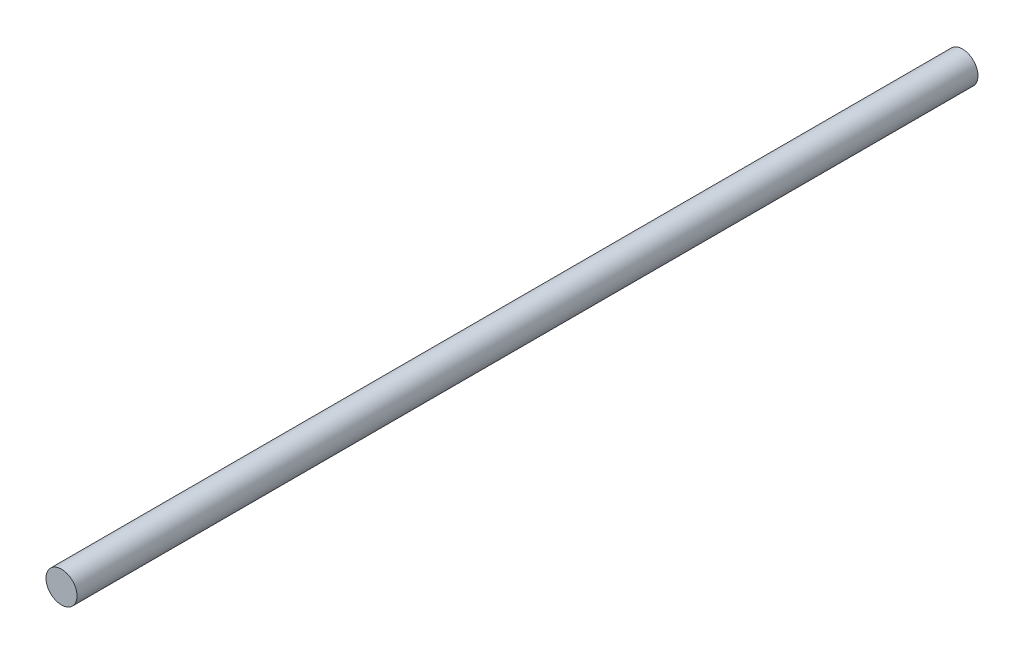
ISO-10303-21;
HEADER;
FILE_DESCRIPTION(('STEP AP214'),'2;1');
FILE_NAME('part.step','',(''),(''),'','','');
FILE_SCHEMA(('AUTOMOTIVE_DESIGN { 1 0 10303 214 1 1 1 1 }'));
ENDSEC;
DATA;
#1=APPLICATION_CONTEXT('core data for automotive mechanical design processes');
#2=APPLICATION_PROTOCOL_DEFINITION('international standard','automotive_design',2000,#1);
#3=PRODUCT_CONTEXT('',#1,'mechanical');
#4=PRODUCT('Part','Part','',(#3));
#5=PRODUCT_RELATED_PRODUCT_CATEGORY('part','',(#4));
#6=PRODUCT_DEFINITION_FORMATION('','',#4);
#7=PRODUCT_DEFINITION_CONTEXT('part definition',#1,'design');
#8=PRODUCT_DEFINITION('design','',#6,#7);
#9=PRODUCT_DEFINITION_SHAPE('','',#8);
#10=(LENGTH_UNIT() NAMED_UNIT(*) SI_UNIT(.MILLI.,.METRE.));
#11=(NAMED_UNIT(*) PLANE_ANGLE_UNIT() SI_UNIT($,.RADIAN.));
#12=(NAMED_UNIT(*) SI_UNIT($,.STERADIAN.) SOLID_ANGLE_UNIT());
#13=UNCERTAINTY_MEASURE_WITH_UNIT(LENGTH_MEASURE(1.E-05),#10,'distance_accuracy_value','');
#14=(GEOMETRIC_REPRESENTATION_CONTEXT(3) GLOBAL_UNCERTAINTY_ASSIGNED_CONTEXT((#13)) GLOBAL_UNIT_ASSIGNED_CONTEXT((#10,
#11,#12)) REPRESENTATION_CONTEXT('',''));
#15=CARTESIAN_POINT('',(0.,0.,0.));
#16=DIRECTION('',(0.,0.,1.));
#17=DIRECTION('',(1.,0.,0.));
#18=AXIS2_PLACEMENT_3D('',#15,#16,#17);
#19=CARTESIAN_POINT('',(0.,0.,-177.787660408044));
#20=DIRECTION('',(0.,0.,1.));
#21=DIRECTION('',(1.,0.,0.));
#22=AXIS2_PLACEMENT_3D('',#19,#20,#21);
#23=PLANE('',#22);
#24=CARTESIAN_POINT('',(0.,0.,-177.787660408044));
#25=DIRECTION('',(0.,0.,1.));
#26=DIRECTION('',(1.,0.,0.));
#27=AXIS2_PLACEMENT_3D('',#24,#25,#26);
#28=CIRCLE('',#27,10.);
#29=CARTESIAN_POINT('',(10.,0.,-177.787660408044));
#30=VERTEX_POINT('',#29);
#31=EDGE_CURVE('E46',#30,#30,#28,.T.);
#32=ORIENTED_EDGE('',*,*,#31,.F.);
#33=EDGE_LOOP('',(#32));
#34=FACE_BOUND('',#33,.T.);
#35=ADVANCED_FACE('F40',(#34),#23,.F.);
#36=CARTESIAN_POINT('',(0.,0.,402.212339591956));
#37=DIRECTION('',(0.,0.,1.));
#38=DIRECTION('',(1.,0.,0.));
#39=AXIS2_PLACEMENT_3D('',#36,#37,#38);
#40=PLANE('',#39);
#41=CARTESIAN_POINT('',(0.,0.,402.212339591956));
#42=DIRECTION('',(0.,0.,1.));
#43=DIRECTION('',(1.,0.,0.));
#44=AXIS2_PLACEMENT_3D('',#41,#42,#43);
#45=CIRCLE('',#44,10.);
#46=CARTESIAN_POINT('',(10.,0.,402.212339591956));
#47=VERTEX_POINT('',#46);
#48=EDGE_CURVE('E11',#47,#47,#45,.T.);
#49=ORIENTED_EDGE('',*,*,#48,.T.);
#50=EDGE_LOOP('',(#49));
#51=FACE_BOUND('',#50,.T.);
#52=ADVANCED_FACE('F55',(#51),#40,.T.);
#53=CARTESIAN_POINT('',(0.,0.,-177.787660408044));
#54=DIRECTION('',(0.,0.,1.));
#55=DIRECTION('',(0.,-1.,0.));
#56=AXIS2_PLACEMENT_3D('',#53,#54,#55);
#57=CYLINDRICAL_SURFACE('',#56,10.);
#58=ORIENTED_EDGE('',*,*,#48,.F.);
#59=EDGE_LOOP('',(#58));
#60=FACE_BOUND('',#59,.T.);
#61=ORIENTED_EDGE('',*,*,#31,.T.);
#62=EDGE_LOOP('',(#61));
#63=FACE_BOUND('',#62,.T.);
#64=ADVANCED_FACE('F52',(#60,#63),#57,.T.);
#65=CLOSED_SHELL('',(#35,#52,#64));
#66=MANIFOLD_SOLID_BREP('B2',#65);
#67=ADVANCED_BREP_SHAPE_REPRESENTATION('',(#18,#66),#14);
#68=SHAPE_DEFINITION_REPRESENTATION(#9,#67);
ENDSEC;
END-ISO-10303-21;
